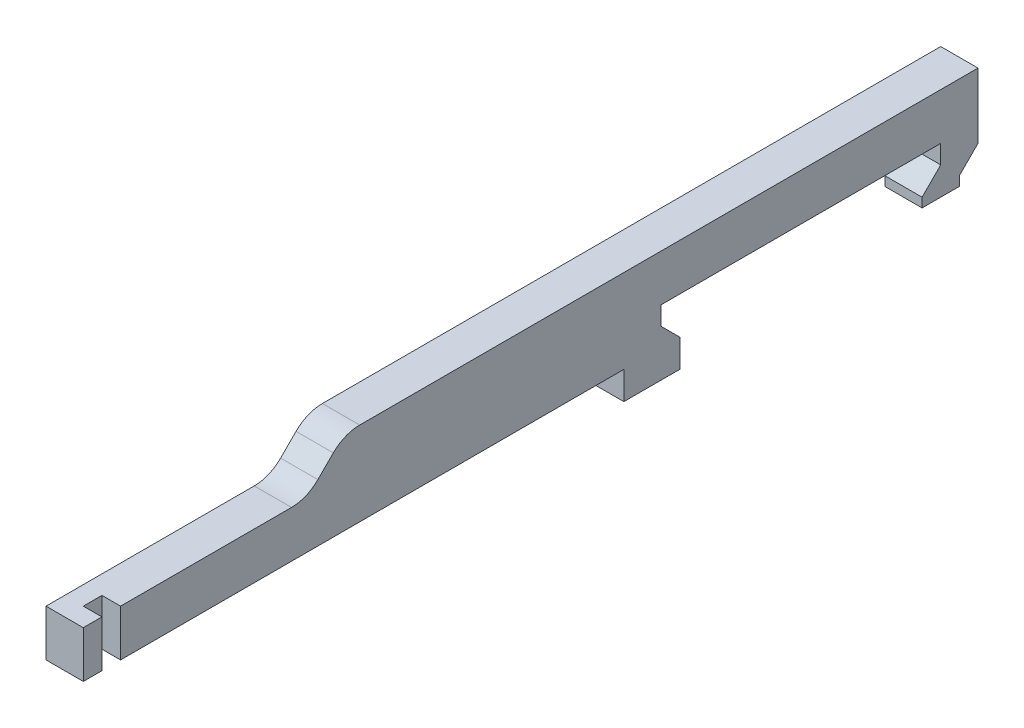
ISO-10303-21;
HEADER;
FILE_DESCRIPTION(('STEP AP214'),'2;1');
FILE_NAME('part.step','',(''),(''),'','','');
FILE_SCHEMA(('AUTOMOTIVE_DESIGN { 1 0 10303 214 1 1 1 1 }'));
ENDSEC;
DATA;
#1=APPLICATION_CONTEXT('core data for automotive mechanical design processes');
#2=APPLICATION_PROTOCOL_DEFINITION('international standard','automotive_design',2000,#1);
#3=PRODUCT_CONTEXT('',#1,'mechanical');
#4=PRODUCT('Part','Part','',(#3));
#5=PRODUCT_RELATED_PRODUCT_CATEGORY('part','',(#4));
#6=PRODUCT_DEFINITION_FORMATION('','',#4);
#7=PRODUCT_DEFINITION_CONTEXT('part definition',#1,'design');
#8=PRODUCT_DEFINITION('design','',#6,#7);
#9=PRODUCT_DEFINITION_SHAPE('','',#8);
#10=(LENGTH_UNIT() NAMED_UNIT(*) SI_UNIT(.MILLI.,.METRE.));
#11=(NAMED_UNIT(*) PLANE_ANGLE_UNIT() SI_UNIT($,.RADIAN.));
#12=(NAMED_UNIT(*) SI_UNIT($,.STERADIAN.) SOLID_ANGLE_UNIT());
#13=UNCERTAINTY_MEASURE_WITH_UNIT(LENGTH_MEASURE(1.E-05),#10,'distance_accuracy_value','');
#14=(GEOMETRIC_REPRESENTATION_CONTEXT(3) GLOBAL_UNCERTAINTY_ASSIGNED_CONTEXT((#13)) GLOBAL_UNIT_ASSIGNED_CONTEXT((#10,
#11,#12)) REPRESENTATION_CONTEXT('',''));
#15=CARTESIAN_POINT('',(0.,0.,0.));
#16=DIRECTION('',(0.,0.,1.));
#17=DIRECTION('',(1.,0.,0.));
#18=AXIS2_PLACEMENT_3D('',#15,#16,#17);
#19=CARTESIAN_POINT('',(2.,0.,0.));
#20=DIRECTION('',(1.,0.,0.));
#21=DIRECTION('',(0.,0.,-1.));
#22=AXIS2_PLACEMENT_3D('',#19,#20,#21);
#23=PLANE('',#22);
#24=DIRECTION('',(0.,-1.,0.));
#25=VECTOR('',#24,1.);
#26=CARTESIAN_POINT('',(2.,0.,-1.));
#27=LINE('',#26,#25);
#28=CARTESIAN_POINT('',(2.,2.5,-1.));
#29=VERTEX_POINT('',#28);
#30=CARTESIAN_POINT('',(2.,0.,-1.));
#31=VERTEX_POINT('',#30);
#32=EDGE_CURVE('E47',#29,#31,#27,.T.);
#33=ORIENTED_EDGE('',*,*,#32,.F.);
#34=DIRECTION('',(0.,0.,-1.));
#35=VECTOR('',#34,1.);
#36=CARTESIAN_POINT('',(2.,2.5,0.));
#37=LINE('',#36,#35);
#38=CARTESIAN_POINT('',(2.,2.5,0.));
#39=VERTEX_POINT('',#38);
#40=EDGE_CURVE('E218',#39,#29,#37,.T.);
#41=ORIENTED_EDGE('',*,*,#40,.F.);
#42=DIRECTION('',(0.,1.,0.));
#43=VECTOR('',#42,1.);
#44=CARTESIAN_POINT('',(2.,0.,0.));
#45=LINE('',#44,#43);
#46=CARTESIAN_POINT('',(2.,0.,0.));
#47=VERTEX_POINT('',#46);
#48=EDGE_CURVE('E222',#47,#39,#45,.T.);
#49=ORIENTED_EDGE('',*,*,#48,.F.);
#50=DIRECTION('',(0.,0.,-1.));
#51=VECTOR('',#50,1.);
#52=CARTESIAN_POINT('',(2.,0.,0.));
#53=LINE('',#52,#51);
#54=EDGE_CURVE('E231',#47,#31,#53,.T.);
#55=ORIENTED_EDGE('',*,*,#54,.T.);
#56=EDGE_LOOP('',(#33,#41,#49,#55));
#57=FACE_BOUND('',#56,.T.);
#58=ADVANCED_FACE('F39',(#57),#23,.T.);
#59=CARTESIAN_POINT('',(2.,0.,-48.));
#60=DIRECTION('',(0.,0.,1.));
#61=DIRECTION('',(1.,0.,0.));
#62=AXIS2_PLACEMENT_3D('',#59,#60,#61);
#63=PLANE('',#62);
#64=DIRECTION('',(0.,1.,0.));
#65=VECTOR('',#64,1.);
#66=CARTESIAN_POINT('',(0.,0.,-48.));
#67=LINE('',#66,#65);
#68=CARTESIAN_POINT('',(0.,0.999999999999994,-48.));
#69=VERTEX_POINT('',#68);
#70=CARTESIAN_POINT('',(0.,4.5,-48.));
#71=VERTEX_POINT('',#70);
#72=EDGE_CURVE('E261',#69,#71,#67,.T.);
#73=ORIENTED_EDGE('',*,*,#72,.T.);
#74=DIRECTION('',(-1.,0.,0.));
#75=VECTOR('',#74,1.);
#76=CARTESIAN_POINT('',(2.,4.5,-48.));
#77=LINE('',#76,#75);
#78=CARTESIAN_POINT('',(2.,4.5,-48.));
#79=VERTEX_POINT('',#78);
#80=EDGE_CURVE('E346',#79,#71,#77,.T.);
#81=ORIENTED_EDGE('',*,*,#80,.F.);
#82=DIRECTION('',(0.,1.,0.));
#83=VECTOR('',#82,1.);
#84=CARTESIAN_POINT('',(2.,0.,-48.));
#85=LINE('',#84,#83);
#86=CARTESIAN_POINT('',(2.,0.999999999999994,-48.));
#87=VERTEX_POINT('',#86);
#88=EDGE_CURVE('E306',#87,#79,#85,.T.);
#89=ORIENTED_EDGE('',*,*,#88,.F.);
#90=DIRECTION('',(-1.,0.,0.));
#91=VECTOR('',#90,1.);
#92=CARTESIAN_POINT('',(2.,0.999999999999994,-48.));
#93=LINE('',#92,#91);
#94=EDGE_CURVE('E260',#87,#69,#93,.T.);
#95=ORIENTED_EDGE('',*,*,#94,.T.);
#96=EDGE_LOOP('',(#73,#81,#89,#95));
#97=FACE_BOUND('',#96,.T.);
#98=ADVANCED_FACE('F433',(#97),#63,.F.);
#99=CARTESIAN_POINT('',(2.,4.49999999999999,0.));
#100=DIRECTION('',(0.,-1.,0.));
#101=DIRECTION('',(0.,0.,-1.));
#102=AXIS2_PLACEMENT_3D('',#99,#100,#101);
#103=PLANE('',#102);
#104=DIRECTION('',(0.,0.,1.));
#105=VECTOR('',#104,1.);
#106=CARTESIAN_POINT('',(0.,4.49999999999999,0.));
#107=LINE('',#106,#105);
#108=CARTESIAN_POINT('',(0.,4.49999999999999,-14.8284271247462));
#109=VERTEX_POINT('',#108);
#110=EDGE_CURVE('E264',#71,#109,#107,.T.);
#111=ORIENTED_EDGE('',*,*,#110,.T.);
#112=DIRECTION('',(-1.,0.,0.));
#113=VECTOR('',#112,1.);
#114=CARTESIAN_POINT('',(2.,4.49999999999999,-14.8284271247462));
#115=LINE('',#114,#113);
#116=CARTESIAN_POINT('',(2.,4.49999999999999,-14.8284271247462));
#117=VERTEX_POINT('',#116);
#118=EDGE_CURVE('E356',#109,#117,#115,.F.);
#119=ORIENTED_EDGE('',*,*,#118,.T.);
#120=DIRECTION('',(0.,0.,1.));
#121=VECTOR('',#120,1.);
#122=CARTESIAN_POINT('',(2.,4.49999999999999,0.));
#123=LINE('',#122,#121);
#124=EDGE_CURVE('E224',#79,#117,#123,.T.);
#125=ORIENTED_EDGE('',*,*,#124,.F.);
#126=ORIENTED_EDGE('',*,*,#80,.T.);
#127=EDGE_LOOP('',(#111,#119,#125,#126));
#128=FACE_BOUND('',#127,.T.);
#129=ADVANCED_FACE('F440',(#128),#103,.F.);
#130=CARTESIAN_POINT('',(2.,-4.75,-4.75));
#131=DIRECTION('',(0.,0.707106781186547,0.707106781186547));
#132=DIRECTION('',(0.,-0.707106781186548,0.707106781186548));
#133=AXIS2_PLACEMENT_3D('',#130,#131,#132);
#134=PLANE('',#133);
#135=DIRECTION('',(0.,0.707106781186548,-0.707106781186548));
#136=VECTOR('',#135,1.);
#137=CARTESIAN_POINT('',(2.,-4.75,-4.75));
#138=LINE('',#137,#136);
#139=CARTESIAN_POINT('',(2.,3.08578643762691,-12.5857864376269));
#140=VERTEX_POINT('',#139);
#141=CARTESIAN_POINT('',(2.,3.91421356237309,-13.4142135623731));
#142=VERTEX_POINT('',#141);
#143=EDGE_CURVE('E219',#140,#142,#138,.T.);
#144=ORIENTED_EDGE('',*,*,#143,.T.);
#145=DIRECTION('',(-1.,0.,0.));
#146=VECTOR('',#145,1.);
#147=CARTESIAN_POINT('',(0.,3.91421356237309,-13.4142135623731));
#148=LINE('',#147,#146);
#149=CARTESIAN_POINT('',(0.,3.91421356237309,-13.4142135623731));
#150=VERTEX_POINT('',#149);
#151=EDGE_CURVE('E351',#142,#150,#148,.T.);
#152=ORIENTED_EDGE('',*,*,#151,.T.);
#153=DIRECTION('',(0.,0.707106781186548,-0.707106781186548));
#154=VECTOR('',#153,1.);
#155=CARTESIAN_POINT('',(0.,-4.75,-4.75));
#156=LINE('',#155,#154);
#157=CARTESIAN_POINT('',(0.,3.08578643762691,-12.5857864376269));
#158=VERTEX_POINT('',#157);
#159=EDGE_CURVE('E268',#158,#150,#156,.T.);
#160=ORIENTED_EDGE('',*,*,#159,.F.);
#161=DIRECTION('',(-1.,0.,0.));
#162=VECTOR('',#161,1.);
#163=CARTESIAN_POINT('',(2.,3.0857864376269,-12.5857864376269));
#164=LINE('',#163,#162);
#165=EDGE_CURVE('E349',#158,#140,#164,.F.);
#166=ORIENTED_EDGE('',*,*,#165,.T.);
#167=EDGE_LOOP('',(#144,#152,#160,#166));
#168=FACE_BOUND('',#167,.T.);
#169=ADVANCED_FACE('F416',(#168),#134,.T.);
#170=CARTESIAN_POINT('',(2.,2.5,0.));
#171=DIRECTION('',(0.,1.,0.));
#172=DIRECTION('',(0.,0.,1.));
#173=AXIS2_PLACEMENT_3D('',#170,#171,#172);
#174=PLANE('',#173);
#175=DIRECTION('',(1.,0.,0.));
#176=VECTOR('',#175,1.);
#177=CARTESIAN_POINT('',(2.,2.5,-1.));
#178=LINE('',#177,#176);
#179=CARTESIAN_POINT('',(1.,2.5,-1.));
#180=VERTEX_POINT('',#179);
#181=EDGE_CURVE('E369',#180,#29,#178,.T.);
#182=ORIENTED_EDGE('',*,*,#181,.F.);
#183=DIRECTION('',(0.,0.,1.));
#184=VECTOR('',#183,1.);
#185=CARTESIAN_POINT('',(1.,2.5,-1.));
#186=LINE('',#185,#184);
#187=CARTESIAN_POINT('',(1.,2.5,-2.));
#188=VERTEX_POINT('',#187);
#189=EDGE_CURVE('E212',#188,#180,#186,.T.);
#190=ORIENTED_EDGE('',*,*,#189,.F.);
#191=DIRECTION('',(-1.,0.,0.));
#192=VECTOR('',#191,1.);
#193=CARTESIAN_POINT('',(1.,2.5,-2.));
#194=LINE('',#193,#192);
#195=CARTESIAN_POINT('',(2.,2.5,-2.));
#196=VERTEX_POINT('',#195);
#197=EDGE_CURVE('E203',#196,#188,#194,.T.);
#198=ORIENTED_EDGE('',*,*,#197,.F.);
#199=CARTESIAN_POINT('',(2.,2.5,-11.1715728752538));
#200=VERTEX_POINT('',#199);
#201=EDGE_CURVE('E62',#196,#200,#37,.T.);
#202=ORIENTED_EDGE('',*,*,#201,.T.);
#203=DIRECTION('',(-1.,0.,0.));
#204=VECTOR('',#203,1.);
#205=CARTESIAN_POINT('',(0.,2.5,-11.1715728752538));
#206=LINE('',#205,#204);
#207=CARTESIAN_POINT('',(0.,2.5,-11.1715728752538));
#208=VERTEX_POINT('',#207);
#209=EDGE_CURVE('E360',#200,#208,#206,.T.);
#210=ORIENTED_EDGE('',*,*,#209,.T.);
#211=DIRECTION('',(0.,0.,-1.));
#212=VECTOR('',#211,1.);
#213=CARTESIAN_POINT('',(0.,2.5,0.));
#214=LINE('',#213,#212);
#215=CARTESIAN_POINT('',(0.,2.5,0.));
#216=VERTEX_POINT('',#215);
#217=EDGE_CURVE('E271',#216,#208,#214,.T.);
#218=ORIENTED_EDGE('',*,*,#217,.F.);
#219=DIRECTION('',(-1.,0.,0.));
#220=VECTOR('',#219,1.);
#221=CARTESIAN_POINT('',(2.,2.5,0.));
#222=LINE('',#221,#220);
#223=EDGE_CURVE('E344',#39,#216,#222,.T.);
#224=ORIENTED_EDGE('',*,*,#223,.F.);
#225=ORIENTED_EDGE('',*,*,#40,.T.);
#226=EDGE_LOOP('',(#182,#190,#198,#202,#210,#218,#224,#225));
#227=FACE_BOUND('',#226,.T.);
#228=ADVANCED_FACE('F210',(#227),#174,.T.);
#229=CARTESIAN_POINT('',(2.,0.,0.));
#230=DIRECTION('',(0.,0.,1.));
#231=DIRECTION('',(1.,0.,0.));
#232=AXIS2_PLACEMENT_3D('',#229,#230,#231);
#233=PLANE('',#232);
#234=DIRECTION('',(0.,1.,0.));
#235=VECTOR('',#234,1.);
#236=CARTESIAN_POINT('',(0.,0.,0.));
#237=LINE('',#236,#235);
#238=CARTESIAN_POINT('',(0.,0.,0.));
#239=VERTEX_POINT('',#238);
#240=EDGE_CURVE('E274',#239,#216,#237,.T.);
#241=ORIENTED_EDGE('',*,*,#240,.F.);
#242=DIRECTION('',(-1.,0.,0.));
#243=VECTOR('',#242,1.);
#244=CARTESIAN_POINT('',(2.,0.,0.));
#245=LINE('',#244,#243);
#246=EDGE_CURVE('E342',#47,#239,#245,.T.);
#247=ORIENTED_EDGE('',*,*,#246,.F.);
#248=ORIENTED_EDGE('',*,*,#48,.T.);
#249=ORIENTED_EDGE('',*,*,#223,.T.);
#250=EDGE_LOOP('',(#241,#247,#248,#249));
#251=FACE_BOUND('',#250,.T.);
#252=ADVANCED_FACE('F379',(#251),#233,.T.);
#253=CARTESIAN_POINT('',(2.,0.,0.));
#254=DIRECTION('',(0.,1.,0.));
#255=DIRECTION('',(0.,0.,1.));
#256=AXIS2_PLACEMENT_3D('',#253,#254,#255);
#257=PLANE('',#256);
#258=DIRECTION('',(0.,0.,1.));
#259=VECTOR('',#258,1.);
#260=CARTESIAN_POINT('',(1.,0.,0.));
#261=LINE('',#260,#259);
#262=CARTESIAN_POINT('',(1.,0.,-2.));
#263=VERTEX_POINT('',#262);
#264=CARTESIAN_POINT('',(1.,0.,-1.));
#265=VERTEX_POINT('',#264);
#266=EDGE_CURVE('E11',#263,#265,#261,.T.);
#267=ORIENTED_EDGE('',*,*,#266,.T.);
#268=DIRECTION('',(1.,0.,0.));
#269=VECTOR('',#268,1.);
#270=CARTESIAN_POINT('',(2.,0.,-1.));
#271=LINE('',#270,#269);
#272=EDGE_CURVE('E265',#265,#31,#271,.T.);
#273=ORIENTED_EDGE('',*,*,#272,.T.);
#274=ORIENTED_EDGE('',*,*,#54,.F.);
#275=ORIENTED_EDGE('',*,*,#246,.T.);
#276=DIRECTION('',(0.,0.,-1.));
#277=VECTOR('',#276,1.);
#278=CARTESIAN_POINT('',(0.,0.,0.));
#279=LINE('',#278,#277);
#280=CARTESIAN_POINT('',(0.,0.,-29.));
#281=VERTEX_POINT('',#280);
#282=EDGE_CURVE('E277',#239,#281,#279,.T.);
#283=ORIENTED_EDGE('',*,*,#282,.T.);
#284=DIRECTION('',(-1.,0.,0.));
#285=VECTOR('',#284,1.);
#286=CARTESIAN_POINT('',(2.,0.,-29.));
#287=LINE('',#286,#285);
#288=CARTESIAN_POINT('',(2.,0.,-29.));
#289=VERTEX_POINT('',#288);
#290=EDGE_CURVE('E339',#289,#281,#287,.T.);
#291=ORIENTED_EDGE('',*,*,#290,.F.);
#292=CARTESIAN_POINT('',(2.,0.,-2.));
#293=VERTEX_POINT('',#292);
#294=EDGE_CURVE('E230',#293,#289,#53,.T.);
#295=ORIENTED_EDGE('',*,*,#294,.F.);
#296=DIRECTION('',(-1.,0.,0.));
#297=VECTOR('',#296,1.);
#298=CARTESIAN_POINT('',(2.,0.,-2.));
#299=LINE('',#298,#297);
#300=EDGE_CURVE('E54',#293,#263,#299,.T.);
#301=ORIENTED_EDGE('',*,*,#300,.T.);
#302=EDGE_LOOP('',(#267,#273,#274,#275,#283,#291,#295,#301));
#303=FACE_BOUND('',#302,.T.);
#304=ADVANCED_FACE('F374',(#303),#257,.F.);
#305=CARTESIAN_POINT('',(2.,0.,-29.));
#306=DIRECTION('',(0.,0.,-1.));
#307=DIRECTION('',(-1.,0.,0.));
#308=AXIS2_PLACEMENT_3D('',#305,#306,#307);
#309=PLANE('',#308);
#310=DIRECTION('',(0.,-1.,0.));
#311=VECTOR('',#310,1.);
#312=CARTESIAN_POINT('',(0.,0.,-29.));
#313=LINE('',#312,#311);
#314=CARTESIAN_POINT('',(0.,-1.5,-29.));
#315=VERTEX_POINT('',#314);
#316=EDGE_CURVE('E279',#281,#315,#313,.T.);
#317=ORIENTED_EDGE('',*,*,#316,.T.);
#318=DIRECTION('',(-1.,0.,0.));
#319=VECTOR('',#318,1.);
#320=CARTESIAN_POINT('',(2.,-1.5,-29.));
#321=LINE('',#320,#319);
#322=CARTESIAN_POINT('',(2.,-1.5,-29.));
#323=VERTEX_POINT('',#322);
#324=EDGE_CURVE('E336',#323,#315,#321,.T.);
#325=ORIENTED_EDGE('',*,*,#324,.F.);
#326=DIRECTION('',(0.,-1.,0.));
#327=VECTOR('',#326,1.);
#328=CARTESIAN_POINT('',(2.,0.,-29.));
#329=LINE('',#328,#327);
#330=EDGE_CURVE('E234',#289,#323,#329,.T.);
#331=ORIENTED_EDGE('',*,*,#330,.F.);
#332=ORIENTED_EDGE('',*,*,#290,.T.);
#333=EDGE_LOOP('',(#317,#325,#331,#332));
#334=FACE_BOUND('',#333,.T.);
#335=ADVANCED_FACE('F390',(#334),#309,.F.);
#336=CARTESIAN_POINT('',(2.,-1.5,0.));
#337=DIRECTION('',(0.,1.,0.));
#338=DIRECTION('',(0.,0.,1.));
#339=AXIS2_PLACEMENT_3D('',#336,#337,#338);
#340=PLANE('',#339);
#341=DIRECTION('',(0.,0.,-1.));
#342=VECTOR('',#341,1.);
#343=CARTESIAN_POINT('',(0.,-1.5,0.));
#344=LINE('',#343,#342);
#345=CARTESIAN_POINT('',(0.,-1.5,-32.));
#346=VERTEX_POINT('',#345);
#347=EDGE_CURVE('E281',#315,#346,#344,.T.);
#348=ORIENTED_EDGE('',*,*,#347,.T.);
#349=DIRECTION('',(-1.,0.,0.));
#350=VECTOR('',#349,1.);
#351=CARTESIAN_POINT('',(2.,-1.5,-32.));
#352=LINE('',#351,#350);
#353=CARTESIAN_POINT('',(2.,-1.5,-32.));
#354=VERTEX_POINT('',#353);
#355=EDGE_CURVE('E333',#354,#346,#352,.T.);
#356=ORIENTED_EDGE('',*,*,#355,.F.);
#357=DIRECTION('',(0.,0.,-1.));
#358=VECTOR('',#357,1.);
#359=CARTESIAN_POINT('',(2.,-1.5,0.));
#360=LINE('',#359,#358);
#361=EDGE_CURVE('E236',#323,#354,#360,.T.);
#362=ORIENTED_EDGE('',*,*,#361,.F.);
#363=ORIENTED_EDGE('',*,*,#324,.T.);
#364=EDGE_LOOP('',(#348,#356,#362,#363));
#365=FACE_BOUND('',#364,.T.);
#366=ADVANCED_FACE('F394',(#365),#340,.F.);
#367=CARTESIAN_POINT('',(2.,0.,-32.));
#368=DIRECTION('',(0.,0.,1.));
#369=DIRECTION('',(1.,0.,0.));
#370=AXIS2_PLACEMENT_3D('',#367,#368,#369);
#371=PLANE('',#370);
#372=DIRECTION('',(0.,1.,0.));
#373=VECTOR('',#372,1.);
#374=CARTESIAN_POINT('',(0.,0.,-32.));
#375=LINE('',#374,#373);
#376=CARTESIAN_POINT('',(0.,0.,-32.));
#377=VERTEX_POINT('',#376);
#378=EDGE_CURVE('E283',#346,#377,#375,.T.);
#379=ORIENTED_EDGE('',*,*,#378,.T.);
#380=DIRECTION('',(-1.,0.,0.));
#381=VECTOR('',#380,1.);
#382=CARTESIAN_POINT('',(2.,0.,-32.));
#383=LINE('',#382,#381);
#384=CARTESIAN_POINT('',(2.,0.,-32.));
#385=VERTEX_POINT('',#384);
#386=EDGE_CURVE('E330',#385,#377,#383,.T.);
#387=ORIENTED_EDGE('',*,*,#386,.F.);
#388=DIRECTION('',(0.,1.,0.));
#389=VECTOR('',#388,1.);
#390=CARTESIAN_POINT('',(2.,0.,-32.));
#391=LINE('',#390,#389);
#392=EDGE_CURVE('E238',#354,#385,#391,.T.);
#393=ORIENTED_EDGE('',*,*,#392,.F.);
#394=ORIENTED_EDGE('',*,*,#355,.T.);
#395=EDGE_LOOP('',(#379,#387,#393,#394));
#396=FACE_BOUND('',#395,.T.);
#397=ADVANCED_FACE('F487',(#396),#371,.F.);
#398=CARTESIAN_POINT('',(2.,16.,-16.));
#399=DIRECTION('',(0.,-0.707106781186548,0.707106781186547));
#400=DIRECTION('',(0.,-0.707106781186547,-0.707106781186548));
#401=AXIS2_PLACEMENT_3D('',#398,#399,#400);
#402=PLANE('',#401);
#403=DIRECTION('',(0.,0.707106781186547,0.707106781186548));
#404=VECTOR('',#403,1.);
#405=CARTESIAN_POINT('',(0.,16.,-16.));
#406=LINE('',#405,#404);
#407=CARTESIAN_POINT('',(0.,1.,-31.));
#408=VERTEX_POINT('',#407);
#409=EDGE_CURVE('E285',#377,#408,#406,.T.);
#410=ORIENTED_EDGE('',*,*,#409,.T.);
#411=DIRECTION('',(-1.,0.,0.));
#412=VECTOR('',#411,1.);
#413=CARTESIAN_POINT('',(2.,1.,-31.));
#414=LINE('',#413,#412);
#415=CARTESIAN_POINT('',(2.,1.,-31.));
#416=VERTEX_POINT('',#415);
#417=EDGE_CURVE('E327',#416,#408,#414,.T.);
#418=ORIENTED_EDGE('',*,*,#417,.F.);
#419=DIRECTION('',(0.,0.707106781186547,0.707106781186548));
#420=VECTOR('',#419,1.);
#421=CARTESIAN_POINT('',(2.,16.,-16.));
#422=LINE('',#421,#420);
#423=EDGE_CURVE('E240',#385,#416,#422,.T.);
#424=ORIENTED_EDGE('',*,*,#423,.F.);
#425=ORIENTED_EDGE('',*,*,#386,.T.);
#426=EDGE_LOOP('',(#410,#418,#424,#425));
#427=FACE_BOUND('',#426,.T.);
#428=ADVANCED_FACE('F483',(#427),#402,.F.);
#429=CARTESIAN_POINT('',(2.,0.,-31.));
#430=DIRECTION('',(0.,0.,1.));
#431=DIRECTION('',(1.,0.,0.));
#432=AXIS2_PLACEMENT_3D('',#429,#430,#431);
#433=PLANE('',#432);
#434=DIRECTION('',(0.,1.,0.));
#435=VECTOR('',#434,1.);
#436=CARTESIAN_POINT('',(0.,0.,-31.));
#437=LINE('',#436,#435);
#438=CARTESIAN_POINT('',(0.,2.,-31.));
#439=VERTEX_POINT('',#438);
#440=EDGE_CURVE('E287',#408,#439,#437,.T.);
#441=ORIENTED_EDGE('',*,*,#440,.T.);
#442=DIRECTION('',(-1.,0.,0.));
#443=VECTOR('',#442,1.);
#444=CARTESIAN_POINT('',(2.,2.,-31.));
#445=LINE('',#444,#443);
#446=CARTESIAN_POINT('',(2.,2.,-31.));
#447=VERTEX_POINT('',#446);
#448=EDGE_CURVE('E324',#447,#439,#445,.T.);
#449=ORIENTED_EDGE('',*,*,#448,.F.);
#450=DIRECTION('',(0.,1.,0.));
#451=VECTOR('',#450,1.);
#452=CARTESIAN_POINT('',(2.,0.,-31.));
#453=LINE('',#452,#451);
#454=EDGE_CURVE('E242',#416,#447,#453,.T.);
#455=ORIENTED_EDGE('',*,*,#454,.F.);
#456=ORIENTED_EDGE('',*,*,#417,.T.);
#457=EDGE_LOOP('',(#441,#449,#455,#456));
#458=FACE_BOUND('',#457,.T.);
#459=ADVANCED_FACE('F479',(#458),#433,.F.);
#460=CARTESIAN_POINT('',(2.,2.,0.));
#461=DIRECTION('',(0.,1.,0.));
#462=DIRECTION('',(0.,0.,1.));
#463=AXIS2_PLACEMENT_3D('',#460,#461,#462);
#464=PLANE('',#463);
#465=DIRECTION('',(0.,0.,-1.));
#466=VECTOR('',#465,1.);
#467=CARTESIAN_POINT('',(0.,2.,0.));
#468=LINE('',#467,#466);
#469=CARTESIAN_POINT('',(0.,2.,-46.));
#470=VERTEX_POINT('',#469);
#471=EDGE_CURVE('E289',#439,#470,#468,.T.);
#472=ORIENTED_EDGE('',*,*,#471,.T.);
#473=DIRECTION('',(-1.,0.,0.));
#474=VECTOR('',#473,1.);
#475=CARTESIAN_POINT('',(2.,2.,-46.));
#476=LINE('',#475,#474);
#477=CARTESIAN_POINT('',(2.,2.,-46.));
#478=VERTEX_POINT('',#477);
#479=EDGE_CURVE('E322',#478,#470,#476,.T.);
#480=ORIENTED_EDGE('',*,*,#479,.F.);
#481=DIRECTION('',(0.,0.,-1.));
#482=VECTOR('',#481,1.);
#483=CARTESIAN_POINT('',(2.,2.,0.));
#484=LINE('',#483,#482);
#485=EDGE_CURVE('E244',#447,#478,#484,.T.);
#486=ORIENTED_EDGE('',*,*,#485,.F.);
#487=ORIENTED_EDGE('',*,*,#448,.T.);
#488=EDGE_LOOP('',(#472,#480,#486,#487));
#489=FACE_BOUND('',#488,.T.);
#490=ADVANCED_FACE('F475',(#489),#464,.F.);
#491=CARTESIAN_POINT('',(2.,0.,-46.));
#492=DIRECTION('',(0.,0.,1.));
#493=DIRECTION('',(1.,0.,0.));
#494=AXIS2_PLACEMENT_3D('',#491,#492,#493);
#495=PLANE('',#494);
#496=DIRECTION('',(0.,1.,0.));
#497=VECTOR('',#496,1.);
#498=CARTESIAN_POINT('',(0.,0.,-46.));
#499=LINE('',#498,#497);
#500=CARTESIAN_POINT('',(0.,1.,-46.));
#501=VERTEX_POINT('',#500);
#502=EDGE_CURVE('E292',#501,#470,#499,.T.);
#503=ORIENTED_EDGE('',*,*,#502,.F.);
#504=DIRECTION('',(-1.,0.,0.));
#505=VECTOR('',#504,1.);
#506=CARTESIAN_POINT('',(2.,1.,-46.));
#507=LINE('',#506,#505);
#508=CARTESIAN_POINT('',(2.,1.,-46.));
#509=VERTEX_POINT('',#508);
#510=EDGE_CURVE('E320',#509,#501,#507,.T.);
#511=ORIENTED_EDGE('',*,*,#510,.F.);
#512=DIRECTION('',(0.,1.,0.));
#513=VECTOR('',#512,1.);
#514=CARTESIAN_POINT('',(2.,0.,-46.));
#515=LINE('',#514,#513);
#516=EDGE_CURVE('E246',#509,#478,#515,.T.);
#517=ORIENTED_EDGE('',*,*,#516,.T.);
#518=ORIENTED_EDGE('',*,*,#479,.T.);
#519=EDGE_LOOP('',(#503,#511,#517,#518));
#520=FACE_BOUND('',#519,.T.);
#521=ADVANCED_FACE('F471',(#520),#495,.T.);
#522=CARTESIAN_POINT('',(2.,-22.5,-22.5));
#523=DIRECTION('',(0.,0.707106781186548,0.707106781186547));
#524=DIRECTION('',(0.,-0.707106781186547,0.707106781186548));
#525=AXIS2_PLACEMENT_3D('',#522,#523,#524);
#526=PLANE('',#525);
#527=DIRECTION('',(0.,0.707106781186547,-0.707106781186548));
#528=VECTOR('',#527,1.);
#529=CARTESIAN_POINT('',(0.,-22.5,-22.5));
#530=LINE('',#529,#528);
#531=CARTESIAN_POINT('',(0.,0.,-45.));
#532=VERTEX_POINT('',#531);
#533=EDGE_CURVE('E295',#532,#501,#530,.T.);
#534=ORIENTED_EDGE('',*,*,#533,.F.);
#535=DIRECTION('',(-1.,0.,0.));
#536=VECTOR('',#535,1.);
#537=CARTESIAN_POINT('',(2.,0.,-45.));
#538=LINE('',#537,#536);
#539=CARTESIAN_POINT('',(2.,0.,-45.));
#540=VERTEX_POINT('',#539);
#541=EDGE_CURVE('E318',#540,#532,#538,.T.);
#542=ORIENTED_EDGE('',*,*,#541,.F.);
#543=DIRECTION('',(0.,0.707106781186547,-0.707106781186548));
#544=VECTOR('',#543,1.);
#545=CARTESIAN_POINT('',(2.,-22.5,-22.5));
#546=LINE('',#545,#544);
#547=EDGE_CURVE('E249',#540,#509,#546,.T.);
#548=ORIENTED_EDGE('',*,*,#547,.T.);
#549=ORIENTED_EDGE('',*,*,#510,.T.);
#550=EDGE_LOOP('',(#534,#542,#548,#549));
#551=FACE_BOUND('',#550,.T.);
#552=ADVANCED_FACE('F467',(#551),#526,.T.);
#553=CARTESIAN_POINT('',(2.,0.,-45.));
#554=DIRECTION('',(0.,0.,-1.));
#555=DIRECTION('',(-1.,0.,0.));
#556=AXIS2_PLACEMENT_3D('',#553,#554,#555);
#557=PLANE('',#556);
#558=DIRECTION('',(0.,-1.,0.));
#559=VECTOR('',#558,1.);
#560=CARTESIAN_POINT('',(0.,0.,-45.));
#561=LINE('',#560,#559);
#562=CARTESIAN_POINT('',(0.,-0.499999999999998,-45.));
#563=VERTEX_POINT('',#562);
#564=EDGE_CURVE('E298',#532,#563,#561,.T.);
#565=ORIENTED_EDGE('',*,*,#564,.T.);
#566=DIRECTION('',(-1.,0.,0.));
#567=VECTOR('',#566,1.);
#568=CARTESIAN_POINT('',(2.,-0.499999999999998,-45.));
#569=LINE('',#568,#567);
#570=CARTESIAN_POINT('',(2.,-0.499999999999998,-45.));
#571=VERTEX_POINT('',#570);
#572=EDGE_CURVE('E315',#571,#563,#569,.T.);
#573=ORIENTED_EDGE('',*,*,#572,.F.);
#574=DIRECTION('',(0.,-1.,0.));
#575=VECTOR('',#574,1.);
#576=CARTESIAN_POINT('',(2.,0.,-45.));
#577=LINE('',#576,#575);
#578=EDGE_CURVE('E252',#540,#571,#577,.T.);
#579=ORIENTED_EDGE('',*,*,#578,.F.);
#580=ORIENTED_EDGE('',*,*,#541,.T.);
#581=EDGE_LOOP('',(#565,#573,#579,#580));
#582=FACE_BOUND('',#581,.T.);
#583=ADVANCED_FACE('F463',(#582),#557,.F.);
#584=CARTESIAN_POINT('',(2.,-0.499999999999998,0.));
#585=DIRECTION('',(0.,1.,0.));
#586=DIRECTION('',(0.,0.,1.));
#587=AXIS2_PLACEMENT_3D('',#584,#585,#586);
#588=PLANE('',#587);
#589=DIRECTION('',(0.,0.,-1.));
#590=VECTOR('',#589,1.);
#591=CARTESIAN_POINT('',(0.,-0.499999999999998,0.));
#592=LINE('',#591,#590);
#593=CARTESIAN_POINT('',(0.,-0.499999999999998,-47.));
#594=VERTEX_POINT('',#593);
#595=EDGE_CURVE('E300',#563,#594,#592,.T.);
#596=ORIENTED_EDGE('',*,*,#595,.T.);
#597=DIRECTION('',(-1.,0.,0.));
#598=VECTOR('',#597,1.);
#599=CARTESIAN_POINT('',(2.,-0.499999999999998,-47.));
#600=LINE('',#599,#598);
#601=CARTESIAN_POINT('',(2.,-0.499999999999998,-47.));
#602=VERTEX_POINT('',#601);
#603=EDGE_CURVE('E312',#602,#594,#600,.T.);
#604=ORIENTED_EDGE('',*,*,#603,.F.);
#605=DIRECTION('',(0.,0.,-1.));
#606=VECTOR('',#605,1.);
#607=CARTESIAN_POINT('',(2.,-0.499999999999998,0.));
#608=LINE('',#607,#606);
#609=EDGE_CURVE('E254',#571,#602,#608,.T.);
#610=ORIENTED_EDGE('',*,*,#609,.F.);
#611=ORIENTED_EDGE('',*,*,#572,.T.);
#612=EDGE_LOOP('',(#596,#604,#610,#611));
#613=FACE_BOUND('',#612,.T.);
#614=ADVANCED_FACE('F457',(#613),#588,.F.);
#615=CARTESIAN_POINT('',(2.,0.,-47.));
#616=DIRECTION('',(0.,0.,1.));
#617=DIRECTION('',(1.,0.,0.));
#618=AXIS2_PLACEMENT_3D('',#615,#616,#617);
#619=PLANE('',#618);
#620=DIRECTION('',(0.,1.,0.));
#621=VECTOR('',#620,1.);
#622=CARTESIAN_POINT('',(0.,0.,-47.));
#623=LINE('',#622,#621);
#624=CARTESIAN_POINT('',(0.,0.,-47.));
#625=VERTEX_POINT('',#624);
#626=EDGE_CURVE('E302',#594,#625,#623,.T.);
#627=ORIENTED_EDGE('',*,*,#626,.T.);
#628=DIRECTION('',(-1.,0.,0.));
#629=VECTOR('',#628,1.);
#630=CARTESIAN_POINT('',(2.,0.,-47.));
#631=LINE('',#630,#629);
#632=CARTESIAN_POINT('',(2.,0.,-47.));
#633=VERTEX_POINT('',#632);
#634=EDGE_CURVE('E309',#633,#625,#631,.T.);
#635=ORIENTED_EDGE('',*,*,#634,.F.);
#636=DIRECTION('',(0.,1.,0.));
#637=VECTOR('',#636,1.);
#638=CARTESIAN_POINT('',(2.,0.,-47.));
#639=LINE('',#638,#637);
#640=EDGE_CURVE('E256',#602,#633,#639,.T.);
#641=ORIENTED_EDGE('',*,*,#640,.F.);
#642=ORIENTED_EDGE('',*,*,#603,.T.);
#643=EDGE_LOOP('',(#627,#635,#641,#642));
#644=FACE_BOUND('',#643,.T.);
#645=ADVANCED_FACE('F451',(#644),#619,.F.);
#646=CARTESIAN_POINT('',(2.,-23.5,-23.5));
#647=DIRECTION('',(0.,0.707106781186548,0.707106781186547));
#648=DIRECTION('',(0.,-0.707106781186547,0.707106781186548));
#649=AXIS2_PLACEMENT_3D('',#646,#647,#648);
#650=PLANE('',#649);
#651=DIRECTION('',(0.,0.707106781186547,-0.707106781186548));
#652=VECTOR('',#651,1.);
#653=CARTESIAN_POINT('',(0.,-23.5,-23.5));
#654=LINE('',#653,#652);
#655=EDGE_CURVE('E304',#625,#69,#654,.T.);
#656=ORIENTED_EDGE('',*,*,#655,.T.);
#657=ORIENTED_EDGE('',*,*,#94,.F.);
#658=DIRECTION('',(0.,0.707106781186547,-0.707106781186548));
#659=VECTOR('',#658,1.);
#660=CARTESIAN_POINT('',(2.,-23.5,-23.5));
#661=LINE('',#660,#659);
#662=EDGE_CURVE('E258',#633,#87,#661,.T.);
#663=ORIENTED_EDGE('',*,*,#662,.F.);
#664=ORIENTED_EDGE('',*,*,#634,.T.);
#665=EDGE_LOOP('',(#656,#657,#663,#664));
#666=FACE_BOUND('',#665,.T.);
#667=ADVANCED_FACE('F445',(#666),#650,.F.);
#668=DIRECTION('',(0.,1.,0.));
#669=VECTOR('',#668,1.);
#670=CARTESIAN_POINT('',(2.,0.,-2.));
#671=LINE('',#670,#669);
#672=EDGE_CURVE('E201',#293,#196,#671,.T.);
#673=ORIENTED_EDGE('',*,*,#672,.F.);
#674=ORIENTED_EDGE('',*,*,#294,.T.);
#675=ORIENTED_EDGE('',*,*,#330,.T.);
#676=ORIENTED_EDGE('',*,*,#361,.T.);
#677=ORIENTED_EDGE('',*,*,#392,.T.);
#678=ORIENTED_EDGE('',*,*,#423,.T.);
#679=ORIENTED_EDGE('',*,*,#454,.T.);
#680=ORIENTED_EDGE('',*,*,#485,.T.);
#681=ORIENTED_EDGE('',*,*,#516,.F.);
#682=ORIENTED_EDGE('',*,*,#547,.F.);
#683=ORIENTED_EDGE('',*,*,#578,.T.);
#684=ORIENTED_EDGE('',*,*,#609,.T.);
#685=ORIENTED_EDGE('',*,*,#640,.T.);
#686=ORIENTED_EDGE('',*,*,#662,.T.);
#687=ORIENTED_EDGE('',*,*,#88,.T.);
#688=ORIENTED_EDGE('',*,*,#124,.T.);
#689=CARTESIAN_POINT('',(2.,2.49999999999999,-14.8284271247462));
#690=DIRECTION('',(1.,0.,0.));
#691=DIRECTION('',(0.,0.,-1.));
#692=AXIS2_PLACEMENT_3D('',#689,#690,#691);
#693=CIRCLE('',#692,2.);
#694=EDGE_CURVE('E358',#117,#142,#693,.T.);
#695=ORIENTED_EDGE('',*,*,#694,.T.);
#696=ORIENTED_EDGE('',*,*,#143,.F.);
#697=CARTESIAN_POINT('',(2.,4.5,-11.1715728752538));
#698=DIRECTION('',(1.,0.,0.));
#699=DIRECTION('',(0.,0.,-1.));
#700=AXIS2_PLACEMENT_3D('',#697,#698,#699);
#701=CIRCLE('',#700,2.);
#702=EDGE_CURVE('E207',#140,#200,#701,.F.);
#703=ORIENTED_EDGE('',*,*,#702,.T.);
#704=ORIENTED_EDGE('',*,*,#201,.F.);
#705=EDGE_LOOP('',(#673,#674,#675,#676,#677,#678,#679,#680,#681,#682,#683,#684,#685,#686,#687,
#688,#695,#696,#703,#704));
#706=FACE_BOUND('',#705,.T.);
#707=ADVANCED_FACE('F214',(#706),#23,.T.);
#708=CARTESIAN_POINT('',(0.,0.,0.));
#709=DIRECTION('',(1.,0.,0.));
#710=DIRECTION('',(0.,0.,-1.));
#711=AXIS2_PLACEMENT_3D('',#708,#709,#710);
#712=PLANE('',#711);
#713=ORIENTED_EDGE('',*,*,#159,.T.);
#714=CARTESIAN_POINT('',(0.,2.49999999999999,-14.8284271247462));
#715=DIRECTION('',(1.,0.,0.));
#716=DIRECTION('',(0.,0.,-1.));
#717=AXIS2_PLACEMENT_3D('',#714,#715,#716);
#718=CIRCLE('',#717,2.);
#719=EDGE_CURVE('E354',#150,#109,#718,.F.);
#720=ORIENTED_EDGE('',*,*,#719,.T.);
#721=ORIENTED_EDGE('',*,*,#110,.F.);
#722=ORIENTED_EDGE('',*,*,#72,.F.);
#723=ORIENTED_EDGE('',*,*,#655,.F.);
#724=ORIENTED_EDGE('',*,*,#626,.F.);
#725=ORIENTED_EDGE('',*,*,#595,.F.);
#726=ORIENTED_EDGE('',*,*,#564,.F.);
#727=ORIENTED_EDGE('',*,*,#533,.T.);
#728=ORIENTED_EDGE('',*,*,#502,.T.);
#729=ORIENTED_EDGE('',*,*,#471,.F.);
#730=ORIENTED_EDGE('',*,*,#440,.F.);
#731=ORIENTED_EDGE('',*,*,#409,.F.);
#732=ORIENTED_EDGE('',*,*,#378,.F.);
#733=ORIENTED_EDGE('',*,*,#347,.F.);
#734=ORIENTED_EDGE('',*,*,#316,.F.);
#735=ORIENTED_EDGE('',*,*,#282,.F.);
#736=ORIENTED_EDGE('',*,*,#240,.T.);
#737=ORIENTED_EDGE('',*,*,#217,.T.);
#738=CARTESIAN_POINT('',(0.,4.5,-11.1715728752538));
#739=DIRECTION('',(1.,0.,0.));
#740=DIRECTION('',(0.,0.,-1.));
#741=AXIS2_PLACEMENT_3D('',#738,#739,#740);
#742=CIRCLE('',#741,2.);
#743=EDGE_CURVE('E362',#208,#158,#742,.T.);
#744=ORIENTED_EDGE('',*,*,#743,.T.);
#745=EDGE_LOOP('',(#713,#720,#721,#722,#723,#724,#725,#726,#727,#728,#729,#730,#731,#732,#733,
#734,#735,#736,#737,#744));
#746=FACE_BOUND('',#745,.T.);
#747=ADVANCED_FACE('F385',(#746),#712,.F.);
#748=CARTESIAN_POINT('',(2.,2.49999999999999,-14.8284271247462));
#749=DIRECTION('',(1.,0.,0.));
#750=DIRECTION('',(0.,0.,-1.));
#751=AXIS2_PLACEMENT_3D('',#748,#749,#750);
#752=CYLINDRICAL_SURFACE('',#751,2.);
#753=ORIENTED_EDGE('',*,*,#694,.F.);
#754=ORIENTED_EDGE('',*,*,#118,.F.);
#755=ORIENTED_EDGE('',*,*,#719,.F.);
#756=ORIENTED_EDGE('',*,*,#151,.F.);
#757=EDGE_LOOP('',(#753,#754,#755,#756));
#758=FACE_BOUND('',#757,.T.);
#759=ADVANCED_FACE('F413',(#758),#752,.T.);
#760=CARTESIAN_POINT('',(2.,4.5,-11.1715728752538));
#761=DIRECTION('',(1.,0.,0.));
#762=DIRECTION('',(0.,0.,-1.));
#763=AXIS2_PLACEMENT_3D('',#760,#761,#762);
#764=CYLINDRICAL_SURFACE('',#763,2.);
#765=ORIENTED_EDGE('',*,*,#702,.F.);
#766=ORIENTED_EDGE('',*,*,#165,.F.);
#767=ORIENTED_EDGE('',*,*,#743,.F.);
#768=ORIENTED_EDGE('',*,*,#209,.F.);
#769=EDGE_LOOP('',(#765,#766,#767,#768));
#770=FACE_BOUND('',#769,.T.);
#771=ADVANCED_FACE('F41',(#770),#764,.F.);
#772=CARTESIAN_POINT('',(1.,-1.5,-1.));
#773=DIRECTION('',(-1.,0.,0.));
#774=DIRECTION('',(0.,0.,1.));
#775=AXIS2_PLACEMENT_3D('',#772,#773,#774);
#776=PLANE('',#775);
#777=DIRECTION('',(0.,1.,0.));
#778=VECTOR('',#777,1.);
#779=CARTESIAN_POINT('',(1.,-1.5,-2.));
#780=LINE('',#779,#778);
#781=EDGE_CURVE('E400',#263,#188,#780,.T.);
#782=ORIENTED_EDGE('',*,*,#781,.T.);
#783=ORIENTED_EDGE('',*,*,#189,.T.);
#784=DIRECTION('',(0.,1.,0.));
#785=VECTOR('',#784,1.);
#786=CARTESIAN_POINT('',(1.,-1.5,-1.));
#787=LINE('',#786,#785);
#788=EDGE_CURVE('E398',#265,#180,#787,.T.);
#789=ORIENTED_EDGE('',*,*,#788,.F.);
#790=ORIENTED_EDGE('',*,*,#266,.F.);
#791=EDGE_LOOP('',(#782,#783,#789,#790));
#792=FACE_BOUND('',#791,.T.);
#793=ADVANCED_FACE('F422',(#792),#776,.F.);
#794=CARTESIAN_POINT('',(2.,-1.5,-1.));
#795=DIRECTION('',(0.,0.,1.));
#796=DIRECTION('',(0.,-1.,0.));
#797=AXIS2_PLACEMENT_3D('',#794,#795,#796);
#798=PLANE('',#797);
#799=ORIENTED_EDGE('',*,*,#788,.T.);
#800=ORIENTED_EDGE('',*,*,#181,.T.);
#801=ORIENTED_EDGE('',*,*,#32,.T.);
#802=ORIENTED_EDGE('',*,*,#272,.F.);
#803=EDGE_LOOP('',(#799,#800,#801,#802));
#804=FACE_BOUND('',#803,.T.);
#805=ADVANCED_FACE('F367',(#804),#798,.F.);
#806=CARTESIAN_POINT('',(1.,-1.5,-2.));
#807=DIRECTION('',(0.,0.,-1.));
#808=DIRECTION('',(0.,1.,0.));
#809=AXIS2_PLACEMENT_3D('',#806,#807,#808);
#810=PLANE('',#809);
#811=ORIENTED_EDGE('',*,*,#672,.T.);
#812=ORIENTED_EDGE('',*,*,#197,.T.);
#813=ORIENTED_EDGE('',*,*,#781,.F.);
#814=ORIENTED_EDGE('',*,*,#300,.F.);
#815=EDGE_LOOP('',(#811,#812,#813,#814));
#816=FACE_BOUND('',#815,.T.);
#817=ADVANCED_FACE('F202',(#816),#810,.F.);
#818=CLOSED_SHELL('',(#58,#98,#129,#169,#228,#252,#304,#335,#366,#397,#428,#459,#490,#521,#552,
#583,#614,#645,#667,#707,#747,#759,#771,#793,#805,#817));
#819=MANIFOLD_SOLID_BREP('B2',#818);
#820=ADVANCED_BREP_SHAPE_REPRESENTATION('',(#18,#819),#14);
#821=SHAPE_DEFINITION_REPRESENTATION(#9,#820);
ENDSEC;
END-ISO-10303-21;
